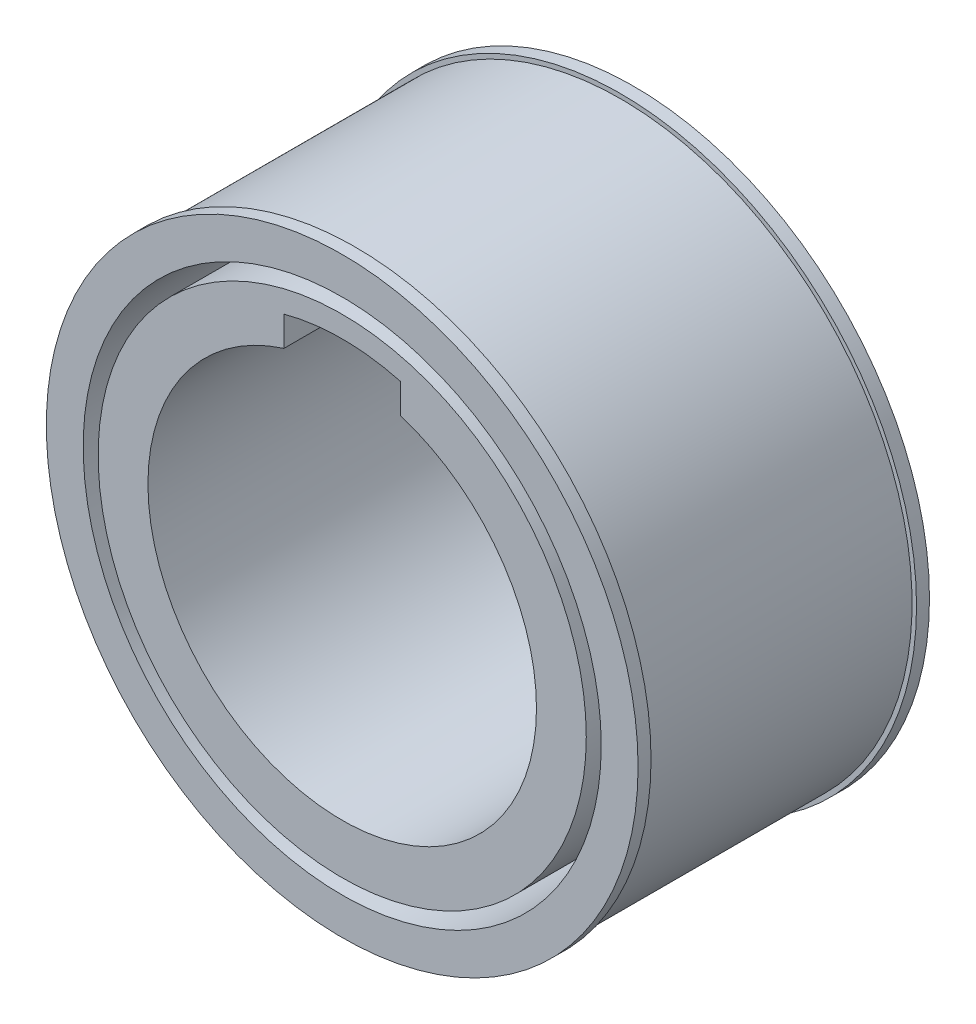
ISO-10303-21;
HEADER;
FILE_DESCRIPTION(('STEP AP214'),'2;1');
FILE_NAME('part.step','',(''),(''),'','','');
FILE_SCHEMA(('AUTOMOTIVE_DESIGN { 1 0 10303 214 1 1 1 1 }'));
ENDSEC;
DATA;
#1=APPLICATION_CONTEXT('core data for automotive mechanical design processes');
#2=APPLICATION_PROTOCOL_DEFINITION('international standard','automotive_design',2000,#1);
#3=PRODUCT_CONTEXT('',#1,'mechanical');
#4=PRODUCT('Part','Part','',(#3));
#5=PRODUCT_RELATED_PRODUCT_CATEGORY('part','',(#4));
#6=PRODUCT_DEFINITION_FORMATION('','',#4);
#7=PRODUCT_DEFINITION_CONTEXT('part definition',#1,'design');
#8=PRODUCT_DEFINITION('design','',#6,#7);
#9=PRODUCT_DEFINITION_SHAPE('','',#8);
#10=(LENGTH_UNIT() NAMED_UNIT(*) SI_UNIT(.MILLI.,.METRE.));
#11=(NAMED_UNIT(*) PLANE_ANGLE_UNIT() SI_UNIT($,.RADIAN.));
#12=(NAMED_UNIT(*) SI_UNIT($,.STERADIAN.) SOLID_ANGLE_UNIT());
#13=UNCERTAINTY_MEASURE_WITH_UNIT(LENGTH_MEASURE(1.E-05),#10,'distance_accuracy_value','');
#14=(GEOMETRIC_REPRESENTATION_CONTEXT(3) GLOBAL_UNCERTAINTY_ASSIGNED_CONTEXT((#13)) GLOBAL_UNIT_ASSIGNED_CONTEXT((#10,
#11,#12)) REPRESENTATION_CONTEXT('',''));
#15=CARTESIAN_POINT('',(0.,0.,0.));
#16=DIRECTION('',(0.,0.,1.));
#17=DIRECTION('',(1.,0.,0.));
#18=AXIS2_PLACEMENT_3D('',#15,#16,#17);
#19=CARTESIAN_POINT('',(0.,0.,22.5));
#20=DIRECTION('',(0.,0.,-1.));
#21=DIRECTION('',(-1.,0.,0.));
#22=AXIS2_PLACEMENT_3D('',#19,#20,#21);
#23=CYLINDRICAL_SURFACE('',#22,45.);
#24=CARTESIAN_POINT('',(0.,0.,20.5));
#25=DIRECTION('',(0.,0.,1.));
#26=DIRECTION('',(1.,0.,0.));
#27=AXIS2_PLACEMENT_3D('',#24,#25,#26);
#28=CIRCLE('',#27,45.);
#29=CARTESIAN_POINT('',(-45.,0.,20.5));
#30=VERTEX_POINT('',#29);
#31=EDGE_CURVE('E119',#30,#30,#28,.T.);
#32=CARTESIAN_POINT('',(0.,0.,-20.5));
#33=DIRECTION('',(0.,0.,-1.));
#34=DIRECTION('',(-1.,0.,0.));
#35=AXIS2_PLACEMENT_3D('',#32,#33,#34);
#36=CIRCLE('',#35,45.);
#37=CARTESIAN_POINT('',(-45.,0.,-20.5));
#38=VERTEX_POINT('',#37);
#39=EDGE_CURVE('E124',#38,#38,#36,.T.);
#40=CARTESIAN_POINT('',(-45.,0.,20.5));
#41=CARTESIAN_POINT('',(-45.,0.,20.0729166666667));
#42=CARTESIAN_POINT('',(-45.,0.,19.6458333333333));
#43=CARTESIAN_POINT('',(-45.,0.,18.7916666666667));
#44=CARTESIAN_POINT('',(-45.,0.,18.3645833333333));
#45=CARTESIAN_POINT('',(-45.,0.,17.5104166666667));
#46=CARTESIAN_POINT('',(-45.,0.,17.0833333333333));
#47=CARTESIAN_POINT('',(-45.,0.,16.2291666666667));
#48=CARTESIAN_POINT('',(-45.,0.,15.8020833333333));
#49=CARTESIAN_POINT('',(-45.,0.,14.9479166666667));
#50=CARTESIAN_POINT('',(-45.,0.,14.5208333333333));
#51=CARTESIAN_POINT('',(-45.,0.,13.6666666666667));
#52=CARTESIAN_POINT('',(-45.,0.,13.2395833333333));
#53=CARTESIAN_POINT('',(-45.,0.,12.3854166666667));
#54=CARTESIAN_POINT('',(-45.,0.,11.9583333333333));
#55=CARTESIAN_POINT('',(-45.,0.,11.1041666666667));
#56=CARTESIAN_POINT('',(-45.,0.,10.6770833333333));
#57=CARTESIAN_POINT('',(-45.,0.,9.82291666666666));
#58=CARTESIAN_POINT('',(-45.,0.,9.39583333333333));
#59=CARTESIAN_POINT('',(-45.,0.,8.54166666666667));
#60=CARTESIAN_POINT('',(-45.,0.,8.11458333333333));
#61=CARTESIAN_POINT('',(-45.,0.,7.26041666666667));
#62=CARTESIAN_POINT('',(-45.,0.,6.83333333333333));
#63=CARTESIAN_POINT('',(-45.,0.,5.97916666666667));
#64=CARTESIAN_POINT('',(-45.,0.,5.55208333333333));
#65=CARTESIAN_POINT('',(-45.,0.,4.69791666666667));
#66=CARTESIAN_POINT('',(-45.,0.,4.27083333333333));
#67=CARTESIAN_POINT('',(-45.,0.,3.41666666666667));
#68=CARTESIAN_POINT('',(-45.,0.,2.98958333333333));
#69=CARTESIAN_POINT('',(-45.,0.,2.13541666666667));
#70=CARTESIAN_POINT('',(-45.,0.,1.70833333333333));
#71=CARTESIAN_POINT('',(-45.,0.,0.854166666666667));
#72=CARTESIAN_POINT('',(-45.,0.,0.427083333333334));
#73=CARTESIAN_POINT('',(-45.,0.,-0.427083333333334));
#74=CARTESIAN_POINT('',(-45.,0.,-0.854166666666667));
#75=CARTESIAN_POINT('',(-45.,0.,-1.70833333333333));
#76=CARTESIAN_POINT('',(-45.,0.,-2.13541666666667));
#77=CARTESIAN_POINT('',(-45.,0.,-2.98958333333333));
#78=CARTESIAN_POINT('',(-45.,0.,-3.41666666666667));
#79=CARTESIAN_POINT('',(-45.,0.,-4.27083333333333));
#80=CARTESIAN_POINT('',(-45.,0.,-4.69791666666667));
#81=CARTESIAN_POINT('',(-45.,0.,-5.55208333333333));
#82=CARTESIAN_POINT('',(-45.,0.,-5.97916666666667));
#83=CARTESIAN_POINT('',(-45.,0.,-6.83333333333333));
#84=CARTESIAN_POINT('',(-45.,0.,-7.26041666666667));
#85=CARTESIAN_POINT('',(-45.,0.,-8.11458333333333));
#86=CARTESIAN_POINT('',(-45.,0.,-8.54166666666666));
#87=CARTESIAN_POINT('',(-45.,0.,-9.39583333333333));
#88=CARTESIAN_POINT('',(-45.,0.,-9.82291666666666));
#89=CARTESIAN_POINT('',(-45.,0.,-10.6770833333333));
#90=CARTESIAN_POINT('',(-45.,0.,-11.1041666666667));
#91=CARTESIAN_POINT('',(-45.,0.,-11.9583333333333));
#92=CARTESIAN_POINT('',(-45.,0.,-12.3854166666667));
#93=CARTESIAN_POINT('',(-45.,0.,-13.2395833333333));
#94=CARTESIAN_POINT('',(-45.,0.,-13.6666666666667));
#95=CARTESIAN_POINT('',(-45.,0.,-14.5208333333333));
#96=CARTESIAN_POINT('',(-45.,0.,-14.9479166666667));
#97=CARTESIAN_POINT('',(-45.,0.,-15.8020833333333));
#98=CARTESIAN_POINT('',(-45.,0.,-16.2291666666667));
#99=CARTESIAN_POINT('',(-45.,0.,-17.0833333333333));
#100=CARTESIAN_POINT('',(-45.,0.,-17.5104166666667));
#101=CARTESIAN_POINT('',(-45.,0.,-18.3645833333333));
#102=CARTESIAN_POINT('',(-45.,0.,-18.7916666666667));
#103=CARTESIAN_POINT('',(-45.,0.,-19.6458333333333));
#104=CARTESIAN_POINT('',(-45.,0.,-20.0729166666667));
#105=CARTESIAN_POINT('',(-45.,0.,-20.5));
#106=B_SPLINE_CURVE_WITH_KNOTS('',3,(#40,#41,#42,#43,#44,#45,#46,#47,#48,#49,#50,#51,#52,#53,
#54,#55,#56,#57,#58,#59,#60,#61,#62,#63,#64,#65,#66,#67,#68,#69,#70,#71,#72,#73,#74,#75,#76,#77,
#78,#79,#80,#81,#82,#83,#84,#85,#86,#87,#88,#89,#90,#91,#92,#93,#94,#95,#96,#97,#98,#99,#100,
#101,#102,#103,#104,#105),.UNSPECIFIED.,.F.,.F.,(4,2,2,2,2,2,2,2,2,2,2,2,2,2,2,2,2,2,2,2,2,2,2,
2,2,2,2,2,2,2,2,2,4),(0.,1.28125,2.5625,3.84375,5.125,6.40625,7.6875,8.96875,10.25,11.53125,
12.8125,14.09375,15.375,16.65625,17.9375,19.21875,20.5,21.78125,23.0625,24.34375,25.625,
26.90625,28.1875,29.46875,30.75,32.03125,33.3125,34.59375,35.875,37.15625,38.4375,39.71875,41.),.UNSPECIFIED.);
#107=EDGE_CURVE('BSEAM33',#30,#38,#106,.T.);
#108=ORIENTED_EDGE('',*,*,#31,.F.);
#109=ORIENTED_EDGE('',*,*,#39,.F.);
#110=ORIENTED_EDGE('',*,*,#107,.T.);
#111=ORIENTED_EDGE('',*,*,#107,.F.);
#112=EDGE_LOOP('',(#108,#110,#109,#111));
#113=FACE_BOUND('',#112,.T.);
#114=ADVANCED_FACE('F33',(#113),#23,.T.);
#115=CARTESIAN_POINT('',(0.,0.,20.5));
#116=DIRECTION('',(0.,0.,1.));
#117=DIRECTION('',(1.,0.,0.));
#118=AXIS2_PLACEMENT_3D('',#115,#116,#117);
#119=CYLINDRICAL_SURFACE('',#118,45.69);
#120=CARTESIAN_POINT('',(0.,0.,20.5));
#121=DIRECTION('',(0.,0.,1.));
#122=DIRECTION('',(1.,0.,0.));
#123=AXIS2_PLACEMENT_3D('',#120,#121,#122);
#124=CIRCLE('',#123,45.69);
#125=CARTESIAN_POINT('',(45.69,0.,20.5));
#126=VERTEX_POINT('',#125);
#127=EDGE_CURVE('E116',#126,#126,#124,.T.);
#128=ORIENTED_EDGE('',*,*,#127,.T.);
#129=EDGE_LOOP('',(#128));
#130=FACE_BOUND('',#129,.T.);
#131=CARTESIAN_POINT('',(0.,0.,22.5));
#132=DIRECTION('',(0.,0.,1.));
#133=DIRECTION('',(1.,0.,0.));
#134=AXIS2_PLACEMENT_3D('',#131,#132,#133);
#135=CIRCLE('',#134,45.69);
#136=CARTESIAN_POINT('',(45.69,0.,22.5));
#137=VERTEX_POINT('',#136);
#138=EDGE_CURVE('E111',#137,#137,#135,.T.);
#139=ORIENTED_EDGE('',*,*,#138,.F.);
#140=EDGE_LOOP('',(#139));
#141=FACE_BOUND('',#140,.T.);
#142=ADVANCED_FACE('F150',(#130,#141),#119,.T.);
#143=CARTESIAN_POINT('',(0.,0.,20.5));
#144=DIRECTION('',(0.,0.,1.));
#145=DIRECTION('',(1.,0.,0.));
#146=AXIS2_PLACEMENT_3D('',#143,#144,#145);
#147=PLANE('',#146);
#148=ORIENTED_EDGE('',*,*,#31,.T.);
#149=EDGE_LOOP('',(#148));
#150=FACE_BOUND('',#149,.T.);
#151=ORIENTED_EDGE('',*,*,#127,.F.);
#152=EDGE_LOOP('',(#151));
#153=FACE_BOUND('',#152,.T.);
#154=ADVANCED_FACE('F155',(#150,#153),#147,.F.);
#155=CARTESIAN_POINT('',(0.,0.,22.5));
#156=DIRECTION('',(0.,0.,1.));
#157=DIRECTION('',(1.,0.,0.));
#158=AXIS2_PLACEMENT_3D('',#155,#156,#157);
#159=PLANE('',#158);
#160=CARTESIAN_POINT('',(0.,0.,22.5));
#161=DIRECTION('',(0.,0.,1.));
#162=DIRECTION('',(1.,0.,0.));
#163=AXIS2_PLACEMENT_3D('',#160,#161,#162);
#164=CIRCLE('',#163,40.);
#165=CARTESIAN_POINT('',(40.,0.,22.5));
#166=VERTEX_POINT('',#165);
#167=EDGE_CURVE('E115',#166,#166,#164,.F.);
#168=ORIENTED_EDGE('',*,*,#167,.T.);
#169=EDGE_LOOP('',(#168));
#170=FACE_BOUND('',#169,.T.);
#171=ORIENTED_EDGE('',*,*,#138,.T.);
#172=EDGE_LOOP('',(#171));
#173=FACE_BOUND('',#172,.T.);
#174=ADVANCED_FACE('F171',(#170,#173),#159,.T.);
#175=CARTESIAN_POINT('',(0.,0.,-20.5));
#176=DIRECTION('',(0.,0.,-1.));
#177=DIRECTION('',(-1.,0.,0.));
#178=AXIS2_PLACEMENT_3D('',#175,#176,#177);
#179=CYLINDRICAL_SURFACE('',#178,45.69);
#180=CARTESIAN_POINT('',(0.,0.,-20.5));
#181=DIRECTION('',(0.,0.,1.));
#182=DIRECTION('',(1.,0.,0.));
#183=AXIS2_PLACEMENT_3D('',#180,#181,#182);
#184=CIRCLE('',#183,45.69);
#185=CARTESIAN_POINT('',(45.69,0.,-20.5));
#186=VERTEX_POINT('',#185);
#187=EDGE_CURVE('E108',#186,#186,#184,.T.);
#188=ORIENTED_EDGE('',*,*,#187,.F.);
#189=EDGE_LOOP('',(#188));
#190=FACE_BOUND('',#189,.T.);
#191=CARTESIAN_POINT('',(0.,0.,-22.5));
#192=DIRECTION('',(0.,0.,1.));
#193=DIRECTION('',(1.,0.,0.));
#194=AXIS2_PLACEMENT_3D('',#191,#192,#193);
#195=CIRCLE('',#194,45.69);
#196=CARTESIAN_POINT('',(45.69,0.,-22.5));
#197=VERTEX_POINT('',#196);
#198=EDGE_CURVE('E112',#197,#197,#195,.T.);
#199=ORIENTED_EDGE('',*,*,#198,.T.);
#200=EDGE_LOOP('',(#199));
#201=FACE_BOUND('',#200,.T.);
#202=ADVANCED_FACE('F165',(#190,#201),#179,.T.);
#203=CARTESIAN_POINT('',(0.,0.,-20.5));
#204=DIRECTION('',(0.,0.,-1.));
#205=DIRECTION('',(1.,0.,0.));
#206=AXIS2_PLACEMENT_3D('',#203,#204,#205);
#207=PLANE('',#206);
#208=ORIENTED_EDGE('',*,*,#39,.T.);
#209=EDGE_LOOP('',(#208));
#210=FACE_BOUND('',#209,.T.);
#211=ORIENTED_EDGE('',*,*,#187,.T.);
#212=EDGE_LOOP('',(#211));
#213=FACE_BOUND('',#212,.T.);
#214=ADVANCED_FACE('F162',(#210,#213),#207,.F.);
#215=CARTESIAN_POINT('',(0.,0.,-22.5));
#216=DIRECTION('',(0.,0.,1.));
#217=DIRECTION('',(1.,0.,0.));
#218=AXIS2_PLACEMENT_3D('',#215,#216,#217);
#219=PLANE('',#218);
#220=CARTESIAN_POINT('',(0.,0.,-22.5));
#221=DIRECTION('',(0.,0.,1.));
#222=DIRECTION('',(1.,0.,0.));
#223=AXIS2_PLACEMENT_3D('',#220,#221,#222);
#224=CIRCLE('',#223,30.);
#225=CARTESIAN_POINT('',(-9.,28.6181760425084,-22.5));
#226=VERTEX_POINT('',#225);
#227=CARTESIAN_POINT('',(9.,28.6181760425084,-22.5));
#228=VERTEX_POINT('',#227);
#229=EDGE_CURVE('E97',#226,#228,#224,.T.);
#230=ORIENTED_EDGE('',*,*,#229,.T.);
#231=DIRECTION('',(0.,1.,0.));
#232=VECTOR('',#231,1.);
#233=CARTESIAN_POINT('',(9.,20.1740873099538,-22.5));
#234=LINE('',#233,#232);
#235=CARTESIAN_POINT('',(9.,33.2018071797304,-22.5));
#236=VERTEX_POINT('',#235);
#237=EDGE_CURVE('E80',#228,#236,#234,.T.);
#238=ORIENTED_EDGE('',*,*,#237,.T.);
#239=CARTESIAN_POINT('',(0.,0.,-22.5));
#240=DIRECTION('',(0.,0.,1.));
#241=DIRECTION('',(1.,0.,0.));
#242=AXIS2_PLACEMENT_3D('',#239,#240,#241);
#243=CIRCLE('',#242,34.4);
#244=CARTESIAN_POINT('',(-9.,33.2018071797304,-22.5));
#245=VERTEX_POINT('',#244);
#246=EDGE_CURVE('E75',#236,#245,#243,.T.);
#247=ORIENTED_EDGE('',*,*,#246,.T.);
#248=DIRECTION('',(0.,-1.,0.));
#249=VECTOR('',#248,1.);
#250=CARTESIAN_POINT('',(-9.,20.1740873099538,-22.5));
#251=LINE('',#250,#249);
#252=EDGE_CURVE('E82',#245,#226,#251,.T.);
#253=ORIENTED_EDGE('',*,*,#252,.T.);
#254=EDGE_LOOP('',(#230,#238,#247,#253));
#255=FACE_BOUND('',#254,.T.);
#256=ORIENTED_EDGE('',*,*,#198,.F.);
#257=EDGE_LOOP('',(#256));
#258=FACE_BOUND('',#257,.T.);
#259=ADVANCED_FACE('F88',(#255,#258),#219,.F.);
#260=CARTESIAN_POINT('',(0.,0.,0.));
#261=DIRECTION('',(0.,0.,1.));
#262=DIRECTION('',(1.,0.,0.));
#263=AXIS2_PLACEMENT_3D('',#260,#261,#262);
#264=PLANE('',#263);
#265=CARTESIAN_POINT('',(0.,0.,0.));
#266=DIRECTION('',(0.,0.,1.));
#267=DIRECTION('',(1.,0.,0.));
#268=AXIS2_PLACEMENT_3D('',#265,#266,#267);
#269=CIRCLE('',#268,40.);
#270=CARTESIAN_POINT('',(40.,0.,0.));
#271=VERTEX_POINT('',#270);
#272=EDGE_CURVE('E104',#271,#271,#269,.T.);
#273=ORIENTED_EDGE('',*,*,#272,.T.);
#274=EDGE_LOOP('',(#273));
#275=FACE_BOUND('',#274,.T.);
#276=CARTESIAN_POINT('',(0.,0.,0.));
#277=DIRECTION('',(0.,0.,1.));
#278=DIRECTION('',(1.,0.,0.));
#279=AXIS2_PLACEMENT_3D('',#276,#277,#278);
#280=CIRCLE('',#279,37.69);
#281=CARTESIAN_POINT('',(37.69,0.,0.));
#282=VERTEX_POINT('',#281);
#283=EDGE_CURVE('E101',#282,#282,#280,.T.);
#284=ORIENTED_EDGE('',*,*,#283,.F.);
#285=EDGE_LOOP('',(#284));
#286=FACE_BOUND('',#285,.T.);
#287=ADVANCED_FACE('F175',(#275,#286),#264,.T.);
#288=CARTESIAN_POINT('',(0.,0.,30.));
#289=DIRECTION('',(0.,0.,-1.));
#290=DIRECTION('',(-1.,0.,0.));
#291=AXIS2_PLACEMENT_3D('',#288,#289,#290);
#292=CYLINDRICAL_SURFACE('',#291,40.);
#293=ORIENTED_EDGE('',*,*,#167,.F.);
#294=EDGE_LOOP('',(#293));
#295=FACE_BOUND('',#294,.T.);
#296=ORIENTED_EDGE('',*,*,#272,.F.);
#297=EDGE_LOOP('',(#296));
#298=FACE_BOUND('',#297,.T.);
#299=ADVANCED_FACE('F179',(#295,#298),#292,.F.);
#300=CARTESIAN_POINT('',(0.,0.,30.));
#301=DIRECTION('',(0.,0.,-1.));
#302=DIRECTION('',(-1.,0.,0.));
#303=AXIS2_PLACEMENT_3D('',#300,#301,#302);
#304=CYLINDRICAL_SURFACE('',#303,37.69);
#305=CARTESIAN_POINT('',(0.,0.,22.5));
#306=DIRECTION('',(0.,0.,1.));
#307=DIRECTION('',(1.,0.,0.));
#308=AXIS2_PLACEMENT_3D('',#305,#306,#307);
#309=CIRCLE('',#308,37.69);
#310=CARTESIAN_POINT('',(37.69,0.,22.5));
#311=VERTEX_POINT('',#310);
#312=EDGE_CURVE('E107',#311,#311,#309,.F.);
#313=ORIENTED_EDGE('',*,*,#312,.T.);
#314=EDGE_LOOP('',(#313));
#315=FACE_BOUND('',#314,.T.);
#316=ORIENTED_EDGE('',*,*,#283,.T.);
#317=EDGE_LOOP('',(#316));
#318=FACE_BOUND('',#317,.T.);
#319=ADVANCED_FACE('F190',(#315,#318),#304,.T.);
#320=DIRECTION('',(0.,1.,0.));
#321=VECTOR('',#320,1.);
#322=CARTESIAN_POINT('',(9.,20.1740873099538,22.5));
#323=LINE('',#322,#321);
#324=CARTESIAN_POINT('',(9.,28.6181760425084,22.5));
#325=VERTEX_POINT('',#324);
#326=CARTESIAN_POINT('',(9.,33.2018071797304,22.5));
#327=VERTEX_POINT('',#326);
#328=EDGE_CURVE('E90',#325,#327,#323,.T.);
#329=ORIENTED_EDGE('',*,*,#328,.F.);
#330=CARTESIAN_POINT('',(0.,0.,22.5));
#331=DIRECTION('',(0.,0.,1.));
#332=DIRECTION('',(1.,0.,0.));
#333=AXIS2_PLACEMENT_3D('',#330,#331,#332);
#334=CIRCLE('',#333,30.);
#335=CARTESIAN_POINT('',(-9.,28.6181760425084,22.5));
#336=VERTEX_POINT('',#335);
#337=EDGE_CURVE('E100',#336,#325,#334,.T.);
#338=ORIENTED_EDGE('',*,*,#337,.F.);
#339=DIRECTION('',(0.,-1.,0.));
#340=VECTOR('',#339,1.);
#341=CARTESIAN_POINT('',(-9.,20.1740873099538,22.5));
#342=LINE('',#341,#340);
#343=CARTESIAN_POINT('',(-9.,33.2018071797304,22.5));
#344=VERTEX_POINT('',#343);
#345=EDGE_CURVE('E47',#344,#336,#342,.T.);
#346=ORIENTED_EDGE('',*,*,#345,.F.);
#347=CARTESIAN_POINT('',(0.,0.,22.5));
#348=DIRECTION('',(0.,0.,1.));
#349=DIRECTION('',(1.,0.,0.));
#350=AXIS2_PLACEMENT_3D('',#347,#348,#349);
#351=CIRCLE('',#350,34.4);
#352=EDGE_CURVE('E78',#327,#344,#351,.T.);
#353=ORIENTED_EDGE('',*,*,#352,.F.);
#354=EDGE_LOOP('',(#329,#338,#346,#353));
#355=FACE_BOUND('',#354,.T.);
#356=ORIENTED_EDGE('',*,*,#312,.F.);
#357=EDGE_LOOP('',(#356));
#358=FACE_BOUND('',#357,.T.);
#359=ADVANCED_FACE('F137',(#355,#358),#159,.T.);
#360=CARTESIAN_POINT('',(0.,0.,-22.5));
#361=DIRECTION('',(0.,0.,1.));
#362=DIRECTION('',(1.,0.,0.));
#363=AXIS2_PLACEMENT_3D('',#360,#361,#362);
#364=CYLINDRICAL_SURFACE('',#363,30.);
#365=ORIENTED_EDGE('',*,*,#337,.T.);
#366=DIRECTION('',(0.,0.,1.));
#367=VECTOR('',#366,1.);
#368=CARTESIAN_POINT('',(9.,28.6181760425084,-22.5));
#369=LINE('',#368,#367);
#370=EDGE_CURVE('E11',#325,#228,#369,.F.);
#371=ORIENTED_EDGE('',*,*,#370,.T.);
#372=ORIENTED_EDGE('',*,*,#229,.F.);
#373=DIRECTION('',(0.,0.,1.));
#374=VECTOR('',#373,1.);
#375=CARTESIAN_POINT('',(-9.,28.6181760425084,-22.5));
#376=LINE('',#375,#374);
#377=EDGE_CURVE('E40',#226,#336,#376,.T.);
#378=ORIENTED_EDGE('',*,*,#377,.T.);
#379=EDGE_LOOP('',(#365,#371,#372,#378));
#380=FACE_BOUND('',#379,.T.);
#381=ADVANCED_FACE('F134',(#380),#364,.F.);
#382=CARTESIAN_POINT('',(9.,20.1740873099538,-22.5));
#383=DIRECTION('',(1.,0.,0.));
#384=DIRECTION('',(0.,0.,-1.));
#385=AXIS2_PLACEMENT_3D('',#382,#383,#384);
#386=PLANE('',#385);
#387=ORIENTED_EDGE('',*,*,#328,.T.);
#388=DIRECTION('',(0.,0.,1.));
#389=VECTOR('',#388,1.);
#390=CARTESIAN_POINT('',(9.,33.2018071797304,-22.5));
#391=LINE('',#390,#389);
#392=EDGE_CURVE('E79',#236,#327,#391,.T.);
#393=ORIENTED_EDGE('',*,*,#392,.F.);
#394=ORIENTED_EDGE('',*,*,#237,.F.);
#395=ORIENTED_EDGE('',*,*,#370,.F.);
#396=EDGE_LOOP('',(#387,#393,#394,#395));
#397=FACE_BOUND('',#396,.T.);
#398=ADVANCED_FACE('F140',(#397),#386,.F.);
#399=CARTESIAN_POINT('',(-9.,20.1740873099538,-22.5));
#400=DIRECTION('',(-1.,0.,0.));
#401=DIRECTION('',(0.,0.,1.));
#402=AXIS2_PLACEMENT_3D('',#399,#400,#401);
#403=PLANE('',#402);
#404=ORIENTED_EDGE('',*,*,#252,.F.);
#405=DIRECTION('',(0.,0.,1.));
#406=VECTOR('',#405,1.);
#407=CARTESIAN_POINT('',(-9.,33.2018071797304,-22.5));
#408=LINE('',#407,#406);
#409=EDGE_CURVE('E71',#245,#344,#408,.T.);
#410=ORIENTED_EDGE('',*,*,#409,.T.);
#411=ORIENTED_EDGE('',*,*,#345,.T.);
#412=ORIENTED_EDGE('',*,*,#377,.F.);
#413=EDGE_LOOP('',(#404,#410,#411,#412));
#414=FACE_BOUND('',#413,.T.);
#415=ADVANCED_FACE('F83',(#414),#403,.F.);
#416=CARTESIAN_POINT('',(0.,0.,-22.5));
#417=DIRECTION('',(0.,0.,1.));
#418=DIRECTION('',(1.,0.,0.));
#419=AXIS2_PLACEMENT_3D('',#416,#417,#418);
#420=CYLINDRICAL_SURFACE('',#419,34.4);
#421=ORIENTED_EDGE('',*,*,#352,.T.);
#422=ORIENTED_EDGE('',*,*,#409,.F.);
#423=ORIENTED_EDGE('',*,*,#246,.F.);
#424=ORIENTED_EDGE('',*,*,#392,.T.);
#425=EDGE_LOOP('',(#421,#422,#423,#424));
#426=FACE_BOUND('',#425,.T.);
#427=ADVANCED_FACE('F72',(#426),#420,.F.);
#428=CLOSED_SHELL('',(#114,#142,#154,#174,#202,#214,#259,#287,#299,#319,#359,#381,#398,#415,#427));
#429=MANIFOLD_SOLID_BREP('B2',#428);
#430=ADVANCED_BREP_SHAPE_REPRESENTATION('',(#18,#429),#14);
#431=SHAPE_DEFINITION_REPRESENTATION(#9,#430);
ENDSEC;
END-ISO-10303-21;
